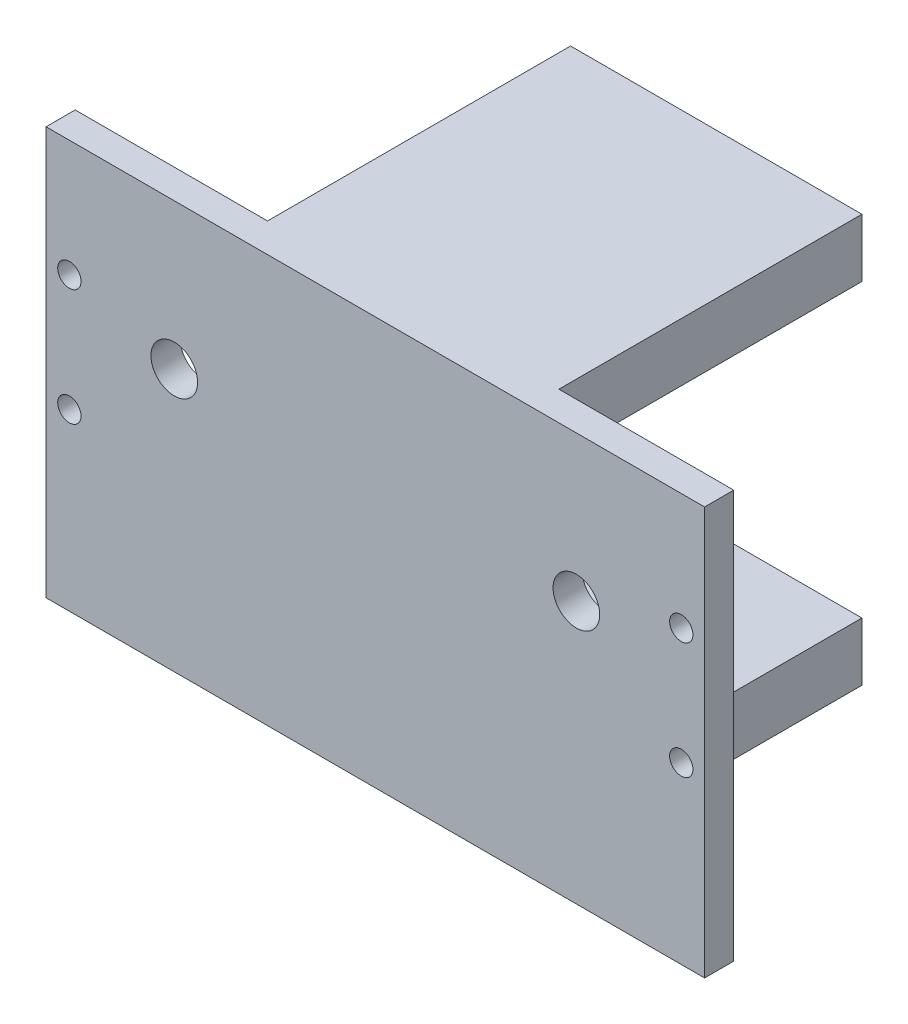
ISO-10303-21;
HEADER;
FILE_DESCRIPTION(('STEP AP214'),'2;1');
FILE_NAME('part.step','',(''),(''),'','','');
FILE_SCHEMA(('AUTOMOTIVE_DESIGN { 1 0 10303 214 1 1 1 1 }'));
ENDSEC;
DATA;
#1=APPLICATION_CONTEXT('core data for automotive mechanical design processes');
#2=APPLICATION_PROTOCOL_DEFINITION('international standard','automotive_design',2000,#1);
#3=PRODUCT_CONTEXT('',#1,'mechanical');
#4=PRODUCT('Part','Part','',(#3));
#5=PRODUCT_RELATED_PRODUCT_CATEGORY('part','',(#4));
#6=PRODUCT_DEFINITION_FORMATION('','',#4);
#7=PRODUCT_DEFINITION_CONTEXT('part definition',#1,'design');
#8=PRODUCT_DEFINITION('design','',#6,#7);
#9=PRODUCT_DEFINITION_SHAPE('','',#8);
#10=(LENGTH_UNIT() NAMED_UNIT(*) SI_UNIT(.MILLI.,.METRE.));
#11=(NAMED_UNIT(*) PLANE_ANGLE_UNIT() SI_UNIT($,.RADIAN.));
#12=(NAMED_UNIT(*) SI_UNIT($,.STERADIAN.) SOLID_ANGLE_UNIT());
#13=UNCERTAINTY_MEASURE_WITH_UNIT(LENGTH_MEASURE(1.E-05),#10,'distance_accuracy_value','');
#14=(GEOMETRIC_REPRESENTATION_CONTEXT(3) GLOBAL_UNCERTAINTY_ASSIGNED_CONTEXT((#13)) GLOBAL_UNIT_ASSIGNED_CONTEXT((#10,
#11,#12)) REPRESENTATION_CONTEXT('',''));
#15=CARTESIAN_POINT('',(0.,0.,0.));
#16=DIRECTION('',(0.,0.,1.));
#17=DIRECTION('',(1.,0.,0.));
#18=AXIS2_PLACEMENT_3D('',#15,#16,#17);
#19=CARTESIAN_POINT('',(0.,0.,0.));
#20=DIRECTION('',(0.,0.,1.));
#21=DIRECTION('',(1.,0.,0.));
#22=AXIS2_PLACEMENT_3D('',#19,#20,#21);
#23=PLANE('',#22);
#24=CARTESIAN_POINT('',(-52.4999999999998,-5.,0.));
#25=DIRECTION('',(0.,0.,1.));
#26=DIRECTION('',(1.,0.,0.));
#27=AXIS2_PLACEMENT_3D('',#24,#25,#26);
#28=CIRCLE('',#27,2.);
#29=CARTESIAN_POINT('',(-50.4999999999998,-5.,0.));
#30=VERTEX_POINT('',#29);
#31=EDGE_CURVE('E289',#30,#30,#28,.T.);
#32=ORIENTED_EDGE('',*,*,#31,.T.);
#33=EDGE_LOOP('',(#32));
#34=FACE_BOUND('',#33,.T.);
#35=CARTESIAN_POINT('',(52.5000000000002,-5.,0.));
#36=DIRECTION('',(0.,0.,1.));
#37=DIRECTION('',(1.,0.,0.));
#38=AXIS2_PLACEMENT_3D('',#35,#36,#37);
#39=CIRCLE('',#38,2.);
#40=CARTESIAN_POINT('',(54.5000000000002,-5.,0.));
#41=VERTEX_POINT('',#40);
#42=EDGE_CURVE('E283',#41,#41,#39,.T.);
#43=ORIENTED_EDGE('',*,*,#42,.T.);
#44=EDGE_LOOP('',(#43));
#45=FACE_BOUND('',#44,.T.);
#46=CARTESIAN_POINT('',(52.5,15.,0.));
#47=DIRECTION('',(0.,0.,1.));
#48=DIRECTION('',(1.,0.,0.));
#49=AXIS2_PLACEMENT_3D('',#46,#47,#48);
#50=CIRCLE('',#49,2.);
#51=CARTESIAN_POINT('',(54.5,15.,0.));
#52=VERTEX_POINT('',#51);
#53=EDGE_CURVE('E277',#52,#52,#50,.T.);
#54=ORIENTED_EDGE('',*,*,#53,.T.);
#55=EDGE_LOOP('',(#54));
#56=FACE_BOUND('',#55,.T.);
#57=CARTESIAN_POINT('',(-52.5,15.,0.));
#58=DIRECTION('',(0.,0.,1.));
#59=DIRECTION('',(1.,0.,0.));
#60=AXIS2_PLACEMENT_3D('',#57,#58,#59);
#61=CIRCLE('',#60,2.);
#62=CARTESIAN_POINT('',(-50.5,15.,0.));
#63=VERTEX_POINT('',#62);
#64=EDGE_CURVE('E269',#63,#63,#61,.T.);
#65=ORIENTED_EDGE('',*,*,#64,.T.);
#66=EDGE_LOOP('',(#65));
#67=FACE_BOUND('',#66,.T.);
#68=CARTESIAN_POINT('',(-34.5,9.99999999999999,0.));
#69=DIRECTION('',(0.,0.,-1.));
#70=DIRECTION('',(-1.,0.,0.));
#71=AXIS2_PLACEMENT_3D('',#68,#69,#70);
#72=CIRCLE('',#71,4.00000000000001);
#73=CARTESIAN_POINT('',(-38.5,9.99999999999999,0.));
#74=VERTEX_POINT('',#73);
#75=EDGE_CURVE('E266',#74,#74,#72,.T.);
#76=ORIENTED_EDGE('',*,*,#75,.F.);
#77=EDGE_LOOP('',(#76));
#78=FACE_BOUND('',#77,.T.);
#79=CARTESIAN_POINT('',(34.5,9.99999999999999,0.));
#80=DIRECTION('',(0.,0.,-1.));
#81=DIRECTION('',(-1.,0.,0.));
#82=AXIS2_PLACEMENT_3D('',#79,#80,#81);
#83=CIRCLE('',#82,4.);
#84=CARTESIAN_POINT('',(30.5,9.99999999999999,0.));
#85=VERTEX_POINT('',#84);
#86=EDGE_CURVE('E260',#85,#85,#83,.T.);
#87=ORIENTED_EDGE('',*,*,#86,.F.);
#88=EDGE_LOOP('',(#87));
#89=FACE_BOUND('',#88,.T.);
#90=DIRECTION('',(0.,-1.,0.));
#91=VECTOR('',#90,1.);
#92=CARTESIAN_POINT('',(26.5,35.,0.));
#93=LINE('',#92,#91);
#94=CARTESIAN_POINT('',(26.5,35.,0.));
#95=VERTEX_POINT('',#94);
#96=CARTESIAN_POINT('',(26.5,25.,0.));
#97=VERTEX_POINT('',#96);
#98=EDGE_CURVE('E147',#95,#97,#93,.T.);
#99=ORIENTED_EDGE('',*,*,#98,.F.);
#100=DIRECTION('',(1.,0.,0.));
#101=VECTOR('',#100,1.);
#102=CARTESIAN_POINT('',(-56.5,35.,0.));
#103=LINE('',#102,#101);
#104=CARTESIAN_POINT('',(56.5,35.,0.));
#105=VERTEX_POINT('',#104);
#106=EDGE_CURVE('E209',#95,#105,#103,.T.);
#107=ORIENTED_EDGE('',*,*,#106,.T.);
#108=DIRECTION('',(0.,-1.,0.));
#109=VECTOR('',#108,1.);
#110=CARTESIAN_POINT('',(56.5,35.,0.));
#111=LINE('',#110,#109);
#112=CARTESIAN_POINT('',(56.5,-35.,0.));
#113=VERTEX_POINT('',#112);
#114=EDGE_CURVE('E195',#105,#113,#111,.T.);
#115=ORIENTED_EDGE('',*,*,#114,.T.);
#116=DIRECTION('',(1.,0.,0.));
#117=VECTOR('',#116,1.);
#118=CARTESIAN_POINT('',(-56.5,-35.,0.));
#119=LINE('',#118,#117);
#120=CARTESIAN_POINT('',(26.5,-35.,0.));
#121=VERTEX_POINT('',#120);
#122=EDGE_CURVE('E191',#121,#113,#119,.T.);
#123=ORIENTED_EDGE('',*,*,#122,.F.);
#124=DIRECTION('',(0.,-1.,0.));
#125=VECTOR('',#124,1.);
#126=CARTESIAN_POINT('',(26.5,-35.,0.));
#127=LINE('',#126,#125);
#128=CARTESIAN_POINT('',(26.5,-25.,0.));
#129=VERTEX_POINT('',#128);
#130=EDGE_CURVE('E39',#129,#121,#127,.T.);
#131=ORIENTED_EDGE('',*,*,#130,.F.);
#132=DIRECTION('',(1.,0.,0.));
#133=VECTOR('',#132,1.);
#134=CARTESIAN_POINT('',(26.5,-25.,0.));
#135=LINE('',#134,#133);
#136=CARTESIAN_POINT('',(-23.5,-25.,0.));
#137=VERTEX_POINT('',#136);
#138=EDGE_CURVE('E159',#137,#129,#135,.T.);
#139=ORIENTED_EDGE('',*,*,#138,.F.);
#140=DIRECTION('',(0.,1.,0.));
#141=VECTOR('',#140,1.);
#142=CARTESIAN_POINT('',(-23.5,-35.,0.));
#143=LINE('',#142,#141);
#144=CARTESIAN_POINT('',(-23.5,-35.,0.));
#145=VERTEX_POINT('',#144);
#146=EDGE_CURVE('E150',#145,#137,#143,.T.);
#147=ORIENTED_EDGE('',*,*,#146,.F.);
#148=CARTESIAN_POINT('',(-56.5,-35.,0.));
#149=VERTEX_POINT('',#148);
#150=EDGE_CURVE('E201',#149,#145,#119,.T.);
#151=ORIENTED_EDGE('',*,*,#150,.F.);
#152=DIRECTION('',(0.,-1.,0.));
#153=VECTOR('',#152,1.);
#154=CARTESIAN_POINT('',(-56.5,35.,0.));
#155=LINE('',#154,#153);
#156=CARTESIAN_POINT('',(-56.5,35.,0.));
#157=VERTEX_POINT('',#156);
#158=EDGE_CURVE('E188',#157,#149,#155,.T.);
#159=ORIENTED_EDGE('',*,*,#158,.F.);
#160=CARTESIAN_POINT('',(-23.5,35.,0.));
#161=VERTEX_POINT('',#160);
#162=EDGE_CURVE('E179',#157,#161,#103,.T.);
#163=ORIENTED_EDGE('',*,*,#162,.T.);
#164=DIRECTION('',(0.,1.,0.));
#165=VECTOR('',#164,1.);
#166=CARTESIAN_POINT('',(-23.5,35.,0.));
#167=LINE('',#166,#165);
#168=CARTESIAN_POINT('',(-23.5,25.,0.));
#169=VERTEX_POINT('',#168);
#170=EDGE_CURVE('E58',#169,#161,#167,.T.);
#171=ORIENTED_EDGE('',*,*,#170,.F.);
#172=DIRECTION('',(-1.,0.,0.));
#173=VECTOR('',#172,1.);
#174=CARTESIAN_POINT('',(26.5,25.,0.));
#175=LINE('',#174,#173);
#176=EDGE_CURVE('E53',#97,#169,#175,.T.);
#177=ORIENTED_EDGE('',*,*,#176,.F.);
#178=EDGE_LOOP('',(#99,#107,#115,#123,#131,#139,#147,#151,#159,#163,#171,#177));
#179=FACE_BOUND('',#178,.T.);
#180=ADVANCED_FACE('F35',(#34,#45,#56,#67,#78,#89,#179),#23,.F.);
#181=CARTESIAN_POINT('',(-56.5,35.,5.));
#182=DIRECTION('',(1.,0.,0.));
#183=DIRECTION('',(0.,1.,0.));
#184=AXIS2_PLACEMENT_3D('',#181,#182,#183);
#185=PLANE('',#184);
#186=ORIENTED_EDGE('',*,*,#158,.T.);
#187=DIRECTION('',(0.,0.,-1.));
#188=VECTOR('',#187,1.);
#189=CARTESIAN_POINT('',(-56.5,-35.,5.));
#190=LINE('',#189,#188);
#191=CARTESIAN_POINT('',(-56.5,-35.,5.));
#192=VERTEX_POINT('',#191);
#193=EDGE_CURVE('E11',#192,#149,#190,.T.);
#194=ORIENTED_EDGE('',*,*,#193,.F.);
#195=DIRECTION('',(0.,-1.,0.));
#196=VECTOR('',#195,1.);
#197=CARTESIAN_POINT('',(-56.5,35.,5.));
#198=LINE('',#197,#196);
#199=CARTESIAN_POINT('',(-56.5,35.,5.));
#200=VERTEX_POINT('',#199);
#201=EDGE_CURVE('E175',#200,#192,#198,.T.);
#202=ORIENTED_EDGE('',*,*,#201,.F.);
#203=DIRECTION('',(0.,0.,-1.));
#204=VECTOR('',#203,1.);
#205=CARTESIAN_POINT('',(-56.5,35.,5.));
#206=LINE('',#205,#204);
#207=EDGE_CURVE('E187',#200,#157,#206,.T.);
#208=ORIENTED_EDGE('',*,*,#207,.T.);
#209=EDGE_LOOP('',(#186,#194,#202,#208));
#210=FACE_BOUND('',#209,.T.);
#211=ADVANCED_FACE('F37',(#210),#185,.F.);
#212=CARTESIAN_POINT('',(-56.5,-35.,5.));
#213=DIRECTION('',(0.,1.,0.));
#214=DIRECTION('',(0.,0.,1.));
#215=AXIS2_PLACEMENT_3D('',#212,#213,#214);
#216=PLANE('',#215);
#217=ORIENTED_EDGE('',*,*,#150,.T.);
#218=DIRECTION('',(0.,0.,1.));
#219=VECTOR('',#218,1.);
#220=CARTESIAN_POINT('',(-23.5,-35.,-52.));
#221=LINE('',#220,#219);
#222=CARTESIAN_POINT('',(-23.5,-35.,-52.));
#223=VERTEX_POINT('',#222);
#224=EDGE_CURVE('E174',#223,#145,#221,.T.);
#225=ORIENTED_EDGE('',*,*,#224,.F.);
#226=DIRECTION('',(-1.,0.,0.));
#227=VECTOR('',#226,1.);
#228=CARTESIAN_POINT('',(26.5,-35.,-52.));
#229=LINE('',#228,#227);
#230=CARTESIAN_POINT('',(26.5,-35.,-52.));
#231=VERTEX_POINT('',#230);
#232=EDGE_CURVE('E158',#231,#223,#229,.T.);
#233=ORIENTED_EDGE('',*,*,#232,.F.);
#234=DIRECTION('',(0.,0.,1.));
#235=VECTOR('',#234,1.);
#236=CARTESIAN_POINT('',(26.5,-35.,-52.));
#237=LINE('',#236,#235);
#238=EDGE_CURVE('E192',#231,#121,#237,.T.);
#239=ORIENTED_EDGE('',*,*,#238,.T.);
#240=ORIENTED_EDGE('',*,*,#122,.T.);
#241=DIRECTION('',(0.,0.,-1.));
#242=VECTOR('',#241,1.);
#243=CARTESIAN_POINT('',(56.5,-35.,5.));
#244=LINE('',#243,#242);
#245=CARTESIAN_POINT('',(56.5,-35.,5.));
#246=VERTEX_POINT('',#245);
#247=EDGE_CURVE('E45',#246,#113,#244,.T.);
#248=ORIENTED_EDGE('',*,*,#247,.F.);
#249=DIRECTION('',(1.,0.,0.));
#250=VECTOR('',#249,1.);
#251=CARTESIAN_POINT('',(-56.5,-35.,5.));
#252=LINE('',#251,#250);
#253=EDGE_CURVE('E178',#192,#246,#252,.T.);
#254=ORIENTED_EDGE('',*,*,#253,.F.);
#255=ORIENTED_EDGE('',*,*,#193,.T.);
#256=EDGE_LOOP('',(#217,#225,#233,#239,#240,#248,#254,#255));
#257=FACE_BOUND('',#256,.T.);
#258=ADVANCED_FACE('F220',(#257),#216,.F.);
#259=CARTESIAN_POINT('',(56.5,35.,5.));
#260=DIRECTION('',(1.,0.,0.));
#261=DIRECTION('',(0.,1.,0.));
#262=AXIS2_PLACEMENT_3D('',#259,#260,#261);
#263=PLANE('',#262);
#264=ORIENTED_EDGE('',*,*,#114,.F.);
#265=DIRECTION('',(0.,0.,-1.));
#266=VECTOR('',#265,1.);
#267=CARTESIAN_POINT('',(56.5,35.,5.));
#268=LINE('',#267,#266);
#269=CARTESIAN_POINT('',(56.5,35.,5.));
#270=VERTEX_POINT('',#269);
#271=EDGE_CURVE('E206',#270,#105,#268,.T.);
#272=ORIENTED_EDGE('',*,*,#271,.F.);
#273=DIRECTION('',(0.,-1.,0.));
#274=VECTOR('',#273,1.);
#275=CARTESIAN_POINT('',(56.5,35.,5.));
#276=LINE('',#275,#274);
#277=EDGE_CURVE('E181',#270,#246,#276,.T.);
#278=ORIENTED_EDGE('',*,*,#277,.T.);
#279=ORIENTED_EDGE('',*,*,#247,.T.);
#280=EDGE_LOOP('',(#264,#272,#278,#279));
#281=FACE_BOUND('',#280,.T.);
#282=ADVANCED_FACE('F216',(#281),#263,.T.);
#283=CARTESIAN_POINT('',(-56.5,35.,5.));
#284=DIRECTION('',(0.,1.,0.));
#285=DIRECTION('',(0.,0.,1.));
#286=AXIS2_PLACEMENT_3D('',#283,#284,#285);
#287=PLANE('',#286);
#288=ORIENTED_EDGE('',*,*,#162,.F.);
#289=ORIENTED_EDGE('',*,*,#207,.F.);
#290=DIRECTION('',(1.,0.,0.));
#291=VECTOR('',#290,1.);
#292=CARTESIAN_POINT('',(-56.5,35.,5.));
#293=LINE('',#292,#291);
#294=EDGE_CURVE('E184',#200,#270,#293,.T.);
#295=ORIENTED_EDGE('',*,*,#294,.T.);
#296=ORIENTED_EDGE('',*,*,#271,.T.);
#297=ORIENTED_EDGE('',*,*,#106,.F.);
#298=DIRECTION('',(0.,0.,1.));
#299=VECTOR('',#298,1.);
#300=CARTESIAN_POINT('',(26.5,35.,-52.));
#301=LINE('',#300,#299);
#302=CARTESIAN_POINT('',(26.5,35.,-52.));
#303=VERTEX_POINT('',#302);
#304=EDGE_CURVE('E251',#303,#95,#301,.T.);
#305=ORIENTED_EDGE('',*,*,#304,.F.);
#306=DIRECTION('',(1.,0.,0.));
#307=VECTOR('',#306,1.);
#308=CARTESIAN_POINT('',(26.5,35.,-52.));
#309=LINE('',#308,#307);
#310=CARTESIAN_POINT('',(-23.5,35.,-52.));
#311=VERTEX_POINT('',#310);
#312=EDGE_CURVE('E141',#311,#303,#309,.T.);
#313=ORIENTED_EDGE('',*,*,#312,.F.);
#314=DIRECTION('',(0.,0.,1.));
#315=VECTOR('',#314,1.);
#316=CARTESIAN_POINT('',(-23.5,35.,-52.));
#317=LINE('',#316,#315);
#318=EDGE_CURVE('E151',#311,#161,#317,.T.);
#319=ORIENTED_EDGE('',*,*,#318,.T.);
#320=EDGE_LOOP('',(#288,#289,#295,#296,#297,#305,#313,#319));
#321=FACE_BOUND('',#320,.T.);
#322=ADVANCED_FACE('F248',(#321),#287,.T.);
#323=CARTESIAN_POINT('',(0.,0.,5.));
#324=DIRECTION('',(0.,0.,1.));
#325=DIRECTION('',(1.,0.,0.));
#326=AXIS2_PLACEMENT_3D('',#323,#324,#325);
#327=PLANE('',#326);
#328=CARTESIAN_POINT('',(-52.4999999999998,-5.,5.));
#329=DIRECTION('',(0.,0.,1.));
#330=DIRECTION('',(1.,0.,0.));
#331=AXIS2_PLACEMENT_3D('',#328,#329,#330);
#332=CIRCLE('',#331,2.);
#333=CARTESIAN_POINT('',(-50.4999999999998,-5.,5.));
#334=VERTEX_POINT('',#333);
#335=EDGE_CURVE('E292',#334,#334,#332,.T.);
#336=ORIENTED_EDGE('',*,*,#335,.F.);
#337=EDGE_LOOP('',(#336));
#338=FACE_BOUND('',#337,.T.);
#339=CARTESIAN_POINT('',(52.5000000000002,-5.,5.));
#340=DIRECTION('',(0.,0.,1.));
#341=DIRECTION('',(1.,0.,0.));
#342=AXIS2_PLACEMENT_3D('',#339,#340,#341);
#343=CIRCLE('',#342,2.);
#344=CARTESIAN_POINT('',(54.5000000000002,-5.,5.));
#345=VERTEX_POINT('',#344);
#346=EDGE_CURVE('E286',#345,#345,#343,.T.);
#347=ORIENTED_EDGE('',*,*,#346,.F.);
#348=EDGE_LOOP('',(#347));
#349=FACE_BOUND('',#348,.T.);
#350=CARTESIAN_POINT('',(52.5,15.,5.));
#351=DIRECTION('',(0.,0.,1.));
#352=DIRECTION('',(1.,0.,0.));
#353=AXIS2_PLACEMENT_3D('',#350,#351,#352);
#354=CIRCLE('',#353,2.);
#355=CARTESIAN_POINT('',(54.5,15.,5.));
#356=VERTEX_POINT('',#355);
#357=EDGE_CURVE('E280',#356,#356,#354,.T.);
#358=ORIENTED_EDGE('',*,*,#357,.F.);
#359=EDGE_LOOP('',(#358));
#360=FACE_BOUND('',#359,.T.);
#361=CARTESIAN_POINT('',(-52.5,15.,5.));
#362=DIRECTION('',(0.,0.,1.));
#363=DIRECTION('',(1.,0.,0.));
#364=AXIS2_PLACEMENT_3D('',#361,#362,#363);
#365=CIRCLE('',#364,2.);
#366=CARTESIAN_POINT('',(-50.5,15.,5.));
#367=VERTEX_POINT('',#366);
#368=EDGE_CURVE('E274',#367,#367,#365,.T.);
#369=ORIENTED_EDGE('',*,*,#368,.F.);
#370=EDGE_LOOP('',(#369));
#371=FACE_BOUND('',#370,.T.);
#372=CARTESIAN_POINT('',(-34.5,9.99999999999999,5.));
#373=DIRECTION('',(0.,0.,-1.));
#374=DIRECTION('',(-1.,0.,0.));
#375=AXIS2_PLACEMENT_3D('',#372,#373,#374);
#376=CIRCLE('',#375,4.00000000000001);
#377=CARTESIAN_POINT('',(-38.5,9.99999999999999,5.));
#378=VERTEX_POINT('',#377);
#379=EDGE_CURVE('E263',#378,#378,#376,.T.);
#380=ORIENTED_EDGE('',*,*,#379,.T.);
#381=EDGE_LOOP('',(#380));
#382=FACE_BOUND('',#381,.T.);
#383=CARTESIAN_POINT('',(34.5,9.99999999999999,5.));
#384=DIRECTION('',(0.,0.,-1.));
#385=DIRECTION('',(-1.,0.,0.));
#386=AXIS2_PLACEMENT_3D('',#383,#384,#385);
#387=CIRCLE('',#386,4.);
#388=CARTESIAN_POINT('',(30.5,9.99999999999999,5.));
#389=VERTEX_POINT('',#388);
#390=EDGE_CURVE('E257',#389,#389,#387,.T.);
#391=ORIENTED_EDGE('',*,*,#390,.T.);
#392=EDGE_LOOP('',(#391));
#393=FACE_BOUND('',#392,.T.);
#394=ORIENTED_EDGE('',*,*,#201,.T.);
#395=ORIENTED_EDGE('',*,*,#253,.T.);
#396=ORIENTED_EDGE('',*,*,#277,.F.);
#397=ORIENTED_EDGE('',*,*,#294,.F.);
#398=EDGE_LOOP('',(#394,#395,#396,#397));
#399=FACE_BOUND('',#398,.T.);
#400=ADVANCED_FACE('F299',(#338,#349,#360,#371,#382,#393,#399),#327,.T.);
#401=CARTESIAN_POINT('',(26.5,-35.,-52.));
#402=DIRECTION('',(-1.,0.,0.));
#403=DIRECTION('',(0.,0.,1.));
#404=AXIS2_PLACEMENT_3D('',#401,#402,#403);
#405=PLANE('',#404);
#406=ORIENTED_EDGE('',*,*,#130,.T.);
#407=ORIENTED_EDGE('',*,*,#238,.F.);
#408=DIRECTION('',(0.,-1.,0.));
#409=VECTOR('',#408,1.);
#410=CARTESIAN_POINT('',(26.5,-35.,-52.));
#411=LINE('',#410,#409);
#412=CARTESIAN_POINT('',(26.5,-25.,-52.));
#413=VERTEX_POINT('',#412);
#414=EDGE_CURVE('E155',#413,#231,#411,.T.);
#415=ORIENTED_EDGE('',*,*,#414,.F.);
#416=DIRECTION('',(0.,0.,1.));
#417=VECTOR('',#416,1.);
#418=CARTESIAN_POINT('',(26.5,-25.,-52.));
#419=LINE('',#418,#417);
#420=EDGE_CURVE('E164',#413,#129,#419,.T.);
#421=ORIENTED_EDGE('',*,*,#420,.T.);
#422=EDGE_LOOP('',(#406,#407,#415,#421));
#423=FACE_BOUND('',#422,.T.);
#424=ADVANCED_FACE('F226',(#423),#405,.F.);
#425=CARTESIAN_POINT('',(-23.5,-35.,-52.));
#426=DIRECTION('',(1.,0.,0.));
#427=DIRECTION('',(0.,0.,-1.));
#428=AXIS2_PLACEMENT_3D('',#425,#426,#427);
#429=PLANE('',#428);
#430=ORIENTED_EDGE('',*,*,#146,.T.);
#431=DIRECTION('',(0.,0.,1.));
#432=VECTOR('',#431,1.);
#433=CARTESIAN_POINT('',(-23.5,-25.,-52.));
#434=LINE('',#433,#432);
#435=CARTESIAN_POINT('',(-23.5,-25.,-52.));
#436=VERTEX_POINT('',#435);
#437=EDGE_CURVE('E171',#436,#137,#434,.T.);
#438=ORIENTED_EDGE('',*,*,#437,.F.);
#439=DIRECTION('',(0.,1.,0.));
#440=VECTOR('',#439,1.);
#441=CARTESIAN_POINT('',(-23.5,-35.,-52.));
#442=LINE('',#441,#440);
#443=EDGE_CURVE('E161',#223,#436,#442,.T.);
#444=ORIENTED_EDGE('',*,*,#443,.F.);
#445=ORIENTED_EDGE('',*,*,#224,.T.);
#446=EDGE_LOOP('',(#430,#438,#444,#445));
#447=FACE_BOUND('',#446,.T.);
#448=ADVANCED_FACE('F235',(#447),#429,.F.);
#449=CARTESIAN_POINT('',(26.5,-25.,-52.));
#450=DIRECTION('',(0.,-1.,0.));
#451=DIRECTION('',(0.,0.,-1.));
#452=AXIS2_PLACEMENT_3D('',#449,#450,#451);
#453=PLANE('',#452);
#454=ORIENTED_EDGE('',*,*,#138,.T.);
#455=ORIENTED_EDGE('',*,*,#420,.F.);
#456=DIRECTION('',(1.,0.,0.));
#457=VECTOR('',#456,1.);
#458=CARTESIAN_POINT('',(26.5,-25.,-52.));
#459=LINE('',#458,#457);
#460=EDGE_CURVE('E163',#436,#413,#459,.T.);
#461=ORIENTED_EDGE('',*,*,#460,.F.);
#462=ORIENTED_EDGE('',*,*,#437,.T.);
#463=EDGE_LOOP('',(#454,#455,#461,#462));
#464=FACE_BOUND('',#463,.T.);
#465=ADVANCED_FACE('F230',(#464),#453,.F.);
#466=CARTESIAN_POINT('',(0.,0.,-52.));
#467=DIRECTION('',(0.,0.,1.));
#468=DIRECTION('',(1.,0.,0.));
#469=AXIS2_PLACEMENT_3D('',#466,#467,#468);
#470=PLANE('',#469);
#471=ORIENTED_EDGE('',*,*,#414,.T.);
#472=ORIENTED_EDGE('',*,*,#232,.T.);
#473=ORIENTED_EDGE('',*,*,#443,.T.);
#474=ORIENTED_EDGE('',*,*,#460,.T.);
#475=EDGE_LOOP('',(#471,#472,#473,#474));
#476=FACE_BOUND('',#475,.T.);
#477=ADVANCED_FACE('F369',(#476),#470,.F.);
#478=CARTESIAN_POINT('',(26.5,35.,-52.));
#479=DIRECTION('',(-1.,0.,0.));
#480=DIRECTION('',(0.,0.,1.));
#481=AXIS2_PLACEMENT_3D('',#478,#479,#480);
#482=PLANE('',#481);
#483=ORIENTED_EDGE('',*,*,#98,.T.);
#484=DIRECTION('',(0.,0.,1.));
#485=VECTOR('',#484,1.);
#486=CARTESIAN_POINT('',(26.5,25.,-52.));
#487=LINE('',#486,#485);
#488=CARTESIAN_POINT('',(26.5,25.,-52.));
#489=VERTEX_POINT('',#488);
#490=EDGE_CURVE('E129',#489,#97,#487,.T.);
#491=ORIENTED_EDGE('',*,*,#490,.F.);
#492=DIRECTION('',(0.,-1.,0.));
#493=VECTOR('',#492,1.);
#494=CARTESIAN_POINT('',(26.5,35.,-52.));
#495=LINE('',#494,#493);
#496=EDGE_CURVE('E136',#303,#489,#495,.T.);
#497=ORIENTED_EDGE('',*,*,#496,.F.);
#498=ORIENTED_EDGE('',*,*,#304,.T.);
#499=EDGE_LOOP('',(#483,#491,#497,#498));
#500=FACE_BOUND('',#499,.T.);
#501=ADVANCED_FACE('F146',(#500),#482,.F.);
#502=CARTESIAN_POINT('',(26.5,25.,-52.));
#503=DIRECTION('',(0.,1.,0.));
#504=DIRECTION('',(0.,0.,1.));
#505=AXIS2_PLACEMENT_3D('',#502,#503,#504);
#506=PLANE('',#505);
#507=ORIENTED_EDGE('',*,*,#176,.T.);
#508=DIRECTION('',(0.,0.,1.));
#509=VECTOR('',#508,1.);
#510=CARTESIAN_POINT('',(-23.5,25.,-52.));
#511=LINE('',#510,#509);
#512=CARTESIAN_POINT('',(-23.5,25.,-52.));
#513=VERTEX_POINT('',#512);
#514=EDGE_CURVE('E132',#513,#169,#511,.T.);
#515=ORIENTED_EDGE('',*,*,#514,.F.);
#516=DIRECTION('',(-1.,0.,0.));
#517=VECTOR('',#516,1.);
#518=CARTESIAN_POINT('',(26.5,25.,-52.));
#519=LINE('',#518,#517);
#520=EDGE_CURVE('E125',#489,#513,#519,.T.);
#521=ORIENTED_EDGE('',*,*,#520,.F.);
#522=ORIENTED_EDGE('',*,*,#490,.T.);
#523=EDGE_LOOP('',(#507,#515,#521,#522));
#524=FACE_BOUND('',#523,.T.);
#525=ADVANCED_FACE('F127',(#524),#506,.F.);
#526=CARTESIAN_POINT('',(-23.5,35.,-52.));
#527=DIRECTION('',(1.,0.,0.));
#528=DIRECTION('',(0.,1.,0.));
#529=AXIS2_PLACEMENT_3D('',#526,#527,#528);
#530=PLANE('',#529);
#531=ORIENTED_EDGE('',*,*,#170,.T.);
#532=ORIENTED_EDGE('',*,*,#318,.F.);
#533=DIRECTION('',(0.,1.,0.));
#534=VECTOR('',#533,1.);
#535=CARTESIAN_POINT('',(-23.5,35.,-52.));
#536=LINE('',#535,#534);
#537=EDGE_CURVE('E135',#513,#311,#536,.T.);
#538=ORIENTED_EDGE('',*,*,#537,.F.);
#539=ORIENTED_EDGE('',*,*,#514,.T.);
#540=EDGE_LOOP('',(#531,#532,#538,#539));
#541=FACE_BOUND('',#540,.T.);
#542=ADVANCED_FACE('F389',(#541),#530,.F.);
#543=CARTESIAN_POINT('',(0.,0.,-52.));
#544=DIRECTION('',(0.,0.,-1.));
#545=DIRECTION('',(-1.,0.,0.));
#546=AXIS2_PLACEMENT_3D('',#543,#544,#545);
#547=PLANE('',#546);
#548=ORIENTED_EDGE('',*,*,#496,.T.);
#549=ORIENTED_EDGE('',*,*,#520,.T.);
#550=ORIENTED_EDGE('',*,*,#537,.T.);
#551=ORIENTED_EDGE('',*,*,#312,.T.);
#552=EDGE_LOOP('',(#548,#549,#550,#551));
#553=FACE_BOUND('',#552,.T.);
#554=ADVANCED_FACE('F139',(#553),#547,.T.);
#555=CARTESIAN_POINT('',(34.5,9.99999999999999,5.));
#556=DIRECTION('',(0.,0.,-1.));
#557=DIRECTION('',(-1.,0.,0.));
#558=AXIS2_PLACEMENT_3D('',#555,#556,#557);
#559=CYLINDRICAL_SURFACE('',#558,4.);
#560=ORIENTED_EDGE('',*,*,#390,.F.);
#561=EDGE_LOOP('',(#560));
#562=FACE_BOUND('',#561,.T.);
#563=ORIENTED_EDGE('',*,*,#86,.T.);
#564=EDGE_LOOP('',(#563));
#565=FACE_BOUND('',#564,.T.);
#566=ADVANCED_FACE('F315',(#562,#565),#559,.F.);
#567=CARTESIAN_POINT('',(-34.5,9.99999999999999,5.));
#568=DIRECTION('',(0.,0.,-1.));
#569=DIRECTION('',(-1.,0.,0.));
#570=AXIS2_PLACEMENT_3D('',#567,#568,#569);
#571=CYLINDRICAL_SURFACE('',#570,4.00000000000001);
#572=ORIENTED_EDGE('',*,*,#379,.F.);
#573=EDGE_LOOP('',(#572));
#574=FACE_BOUND('',#573,.T.);
#575=ORIENTED_EDGE('',*,*,#75,.T.);
#576=EDGE_LOOP('',(#575));
#577=FACE_BOUND('',#576,.T.);
#578=ADVANCED_FACE('F318',(#574,#577),#571,.F.);
#579=CARTESIAN_POINT('',(-52.5,15.,-52.000025));
#580=DIRECTION('',(0.,0.,1.));
#581=DIRECTION('',(1.,0.,0.));
#582=AXIS2_PLACEMENT_3D('',#579,#580,#581);
#583=CYLINDRICAL_SURFACE('',#582,2.);
#584=CARTESIAN_POINT('',(-50.5,15.,5.));
#585=CARTESIAN_POINT('',(-50.5,15.,4.94791666666667));
#586=CARTESIAN_POINT('',(-50.5,15.,4.89583333333334));
#587=CARTESIAN_POINT('',(-50.5,15.,4.79166666666667));
#588=CARTESIAN_POINT('',(-50.5,15.,4.73958333333334));
#589=CARTESIAN_POINT('',(-50.5,15.,4.63541666666667));
#590=CARTESIAN_POINT('',(-50.5,15.,4.58333333333333));
#591=CARTESIAN_POINT('',(-50.5,15.,4.47916666666667));
#592=CARTESIAN_POINT('',(-50.5,15.,4.42708333333334));
#593=CARTESIAN_POINT('',(-50.5,15.,4.32291666666667));
#594=CARTESIAN_POINT('',(-50.5,15.,4.27083333333334));
#595=CARTESIAN_POINT('',(-50.5,15.,4.16666666666667));
#596=CARTESIAN_POINT('',(-50.5,15.,4.11458333333334));
#597=CARTESIAN_POINT('',(-50.5,15.,4.01041666666667));
#598=CARTESIAN_POINT('',(-50.5,15.,3.95833333333333));
#599=CARTESIAN_POINT('',(-50.5,15.,3.85416666666667));
#600=CARTESIAN_POINT('',(-50.5,15.,3.80208333333334));
#601=CARTESIAN_POINT('',(-50.5,15.,3.69791666666667));
#602=CARTESIAN_POINT('',(-50.5,15.,3.64583333333334));
#603=CARTESIAN_POINT('',(-50.5,15.,3.54166666666667));
#604=CARTESIAN_POINT('',(-50.5,15.,3.48958333333334));
#605=CARTESIAN_POINT('',(-50.5,15.,3.38541666666667));
#606=CARTESIAN_POINT('',(-50.5,15.,3.33333333333333));
#607=CARTESIAN_POINT('',(-50.5,15.,3.22916666666667));
#608=CARTESIAN_POINT('',(-50.5,15.,3.17708333333334));
#609=CARTESIAN_POINT('',(-50.5,15.,3.07291666666667));
#610=CARTESIAN_POINT('',(-50.5,15.,3.02083333333334));
#611=CARTESIAN_POINT('',(-50.5,15.,2.91666666666667));
#612=CARTESIAN_POINT('',(-50.5,15.,2.86458333333334));
#613=CARTESIAN_POINT('',(-50.5,15.,2.76041666666667));
#614=CARTESIAN_POINT('',(-50.5,15.,2.70833333333333));
#615=CARTESIAN_POINT('',(-50.5,15.,2.60416666666667));
#616=CARTESIAN_POINT('',(-50.5,15.,2.55208333333333));
#617=CARTESIAN_POINT('',(-50.5,15.,2.44791666666667));
#618=CARTESIAN_POINT('',(-50.5,15.,2.39583333333334));
#619=CARTESIAN_POINT('',(-50.5,15.,2.29166666666667));
#620=CARTESIAN_POINT('',(-50.5,15.,2.23958333333334));
#621=CARTESIAN_POINT('',(-50.5,15.,2.13541666666667));
#622=CARTESIAN_POINT('',(-50.5,15.,2.08333333333333));
#623=CARTESIAN_POINT('',(-50.5,15.,1.97916666666667));
#624=CARTESIAN_POINT('',(-50.5,15.,1.92708333333333));
#625=CARTESIAN_POINT('',(-50.5,15.,1.82291666666667));
#626=CARTESIAN_POINT('',(-50.5,15.,1.77083333333334));
#627=CARTESIAN_POINT('',(-50.5,15.,1.66666666666667));
#628=CARTESIAN_POINT('',(-50.5,15.,1.61458333333334));
#629=CARTESIAN_POINT('',(-50.5,15.,1.51041666666667));
#630=CARTESIAN_POINT('',(-50.5,15.,1.45833333333333));
#631=CARTESIAN_POINT('',(-50.5,15.,1.35416666666667));
#632=CARTESIAN_POINT('',(-50.5,15.,1.30208333333333));
#633=CARTESIAN_POINT('',(-50.5,15.,1.19791666666667));
#634=CARTESIAN_POINT('',(-50.5,15.,1.14583333333334));
#635=CARTESIAN_POINT('',(-50.5,15.,1.04166666666667));
#636=CARTESIAN_POINT('',(-50.5,15.,0.989583333333335));
#637=CARTESIAN_POINT('',(-50.5,15.,0.885416666666666));
#638=CARTESIAN_POINT('',(-50.5,15.,0.833333333333332));
#639=CARTESIAN_POINT('',(-50.5,15.,0.729166666666665));
#640=CARTESIAN_POINT('',(-50.5,15.,0.677083333333333));
#641=CARTESIAN_POINT('',(-50.5,15.,0.572916666666668));
#642=CARTESIAN_POINT('',(-50.5,15.,0.520833333333336));
#643=CARTESIAN_POINT('',(-50.5,15.,0.416666666666669));
#644=CARTESIAN_POINT('',(-50.5,15.,0.364583333333335));
#645=CARTESIAN_POINT('',(-50.5,15.,0.260416666666666));
#646=CARTESIAN_POINT('',(-50.5,15.,0.208333333333331));
#647=CARTESIAN_POINT('',(-50.5,15.,0.104166666666664));
#648=CARTESIAN_POINT('',(-50.5,15.,0.0520833333333322));
#649=CARTESIAN_POINT('',(-50.5,15.,0.));
#650=B_SPLINE_CURVE_WITH_KNOTS('',3,(#584,#585,#586,#587,#588,#589,#590,#591,#592,#593,#594,
#595,#596,#597,#598,#599,#600,#601,#602,#603,#604,#605,#606,#607,#608,#609,#610,#611,#612,#613,
#614,#615,#616,#617,#618,#619,#620,#621,#622,#623,#624,#625,#626,#627,#628,#629,#630,#631,#632,
#633,#634,#635,#636,#637,#638,#639,#640,#641,#642,#643,#644,#645,#646,#647,#648,#649),
.UNSPECIFIED.,.F.,.F.,(4,2,2,2,2,2,2,2,2,2,2,2,2,2,2,2,2,2,2,2,2,2,2,2,2,2,2,2,2,2,2,2,4),(0.,
0.156249999999997,0.3125,0.468750000000004,0.625000000000001,0.781249999999997,
0.937500000000001,1.09375,1.25,1.40625,1.5625,1.71875,1.875,2.03125,2.1875,2.34375000000001,2.5,
2.65625,2.8125,2.96875000000001,3.125,3.28125,3.4375,3.59375000000001,3.75,3.90625,4.0625,
4.21875000000001,4.375,4.53125,4.6875,4.84375000000001,5.),.UNSPECIFIED.);
#651=EDGE_CURVE('BSEAM412',#367,#63,#650,.T.);
#652=ORIENTED_EDGE('',*,*,#368,.T.);
#653=ORIENTED_EDGE('',*,*,#64,.F.);
#654=ORIENTED_EDGE('',*,*,#651,.T.);
#655=ORIENTED_EDGE('',*,*,#651,.F.);
#656=EDGE_LOOP('',(#652,#654,#653,#655));
#657=FACE_BOUND('',#656,.T.);
#658=ADVANCED_FACE('F412',(#657),#583,.F.);
#659=CARTESIAN_POINT('',(52.5,15.,-52.000025));
#660=DIRECTION('',(0.,0.,1.));
#661=DIRECTION('',(1.,0.,0.));
#662=AXIS2_PLACEMENT_3D('',#659,#660,#661);
#663=CYLINDRICAL_SURFACE('',#662,2.);
#664=CARTESIAN_POINT('',(54.5,15.,5.));
#665=CARTESIAN_POINT('',(54.5,15.,4.94791666666667));
#666=CARTESIAN_POINT('',(54.5,15.,4.89583333333334));
#667=CARTESIAN_POINT('',(54.5,15.,4.79166666666667));
#668=CARTESIAN_POINT('',(54.5,15.,4.73958333333334));
#669=CARTESIAN_POINT('',(54.5,15.,4.63541666666667));
#670=CARTESIAN_POINT('',(54.5,15.,4.58333333333333));
#671=CARTESIAN_POINT('',(54.5,15.,4.47916666666667));
#672=CARTESIAN_POINT('',(54.5,15.,4.42708333333334));
#673=CARTESIAN_POINT('',(54.5,15.,4.32291666666667));
#674=CARTESIAN_POINT('',(54.5,15.,4.27083333333334));
#675=CARTESIAN_POINT('',(54.5,15.,4.16666666666667));
#676=CARTESIAN_POINT('',(54.5,15.,4.11458333333334));
#677=CARTESIAN_POINT('',(54.5,15.,4.01041666666667));
#678=CARTESIAN_POINT('',(54.5,15.,3.95833333333333));
#679=CARTESIAN_POINT('',(54.5,15.,3.85416666666667));
#680=CARTESIAN_POINT('',(54.5,15.,3.80208333333334));
#681=CARTESIAN_POINT('',(54.5,15.,3.69791666666667));
#682=CARTESIAN_POINT('',(54.5,15.,3.64583333333334));
#683=CARTESIAN_POINT('',(54.5,15.,3.54166666666667));
#684=CARTESIAN_POINT('',(54.5,15.,3.48958333333334));
#685=CARTESIAN_POINT('',(54.5,15.,3.38541666666667));
#686=CARTESIAN_POINT('',(54.5,15.,3.33333333333333));
#687=CARTESIAN_POINT('',(54.5,15.,3.22916666666667));
#688=CARTESIAN_POINT('',(54.5,15.,3.17708333333334));
#689=CARTESIAN_POINT('',(54.5,15.,3.07291666666667));
#690=CARTESIAN_POINT('',(54.5,15.,3.02083333333334));
#691=CARTESIAN_POINT('',(54.5,15.,2.91666666666667));
#692=CARTESIAN_POINT('',(54.5,15.,2.86458333333334));
#693=CARTESIAN_POINT('',(54.5,15.,2.76041666666667));
#694=CARTESIAN_POINT('',(54.5,15.,2.70833333333333));
#695=CARTESIAN_POINT('',(54.5,15.,2.60416666666667));
#696=CARTESIAN_POINT('',(54.5,15.,2.55208333333333));
#697=CARTESIAN_POINT('',(54.5,15.,2.44791666666667));
#698=CARTESIAN_POINT('',(54.5,15.,2.39583333333334));
#699=CARTESIAN_POINT('',(54.5,15.,2.29166666666667));
#700=CARTESIAN_POINT('',(54.5,15.,2.23958333333334));
#701=CARTESIAN_POINT('',(54.5,15.,2.13541666666667));
#702=CARTESIAN_POINT('',(54.5,15.,2.08333333333333));
#703=CARTESIAN_POINT('',(54.5,15.,1.97916666666667));
#704=CARTESIAN_POINT('',(54.5,15.,1.92708333333333));
#705=CARTESIAN_POINT('',(54.5,15.,1.82291666666667));
#706=CARTESIAN_POINT('',(54.5,15.,1.77083333333334));
#707=CARTESIAN_POINT('',(54.5,15.,1.66666666666667));
#708=CARTESIAN_POINT('',(54.5,15.,1.61458333333334));
#709=CARTESIAN_POINT('',(54.5,15.,1.51041666666667));
#710=CARTESIAN_POINT('',(54.5,15.,1.45833333333333));
#711=CARTESIAN_POINT('',(54.5,15.,1.35416666666667));
#712=CARTESIAN_POINT('',(54.5,15.,1.30208333333333));
#713=CARTESIAN_POINT('',(54.5,15.,1.19791666666667));
#714=CARTESIAN_POINT('',(54.5,15.,1.14583333333334));
#715=CARTESIAN_POINT('',(54.5,15.,1.04166666666667));
#716=CARTESIAN_POINT('',(54.5,15.,0.989583333333335));
#717=CARTESIAN_POINT('',(54.5,15.,0.885416666666666));
#718=CARTESIAN_POINT('',(54.5,15.,0.833333333333332));
#719=CARTESIAN_POINT('',(54.5,15.,0.729166666666665));
#720=CARTESIAN_POINT('',(54.5,15.,0.677083333333333));
#721=CARTESIAN_POINT('',(54.5,15.,0.572916666666668));
#722=CARTESIAN_POINT('',(54.5,15.,0.520833333333336));
#723=CARTESIAN_POINT('',(54.5,15.,0.416666666666669));
#724=CARTESIAN_POINT('',(54.5,15.,0.364583333333335));
#725=CARTESIAN_POINT('',(54.5,15.,0.260416666666666));
#726=CARTESIAN_POINT('',(54.5,15.,0.208333333333331));
#727=CARTESIAN_POINT('',(54.5,15.,0.104166666666664));
#728=CARTESIAN_POINT('',(54.5,15.,0.0520833333333322));
#729=CARTESIAN_POINT('',(54.5,15.,0.));
#730=B_SPLINE_CURVE_WITH_KNOTS('',3,(#664,#665,#666,#667,#668,#669,#670,#671,#672,#673,#674,
#675,#676,#677,#678,#679,#680,#681,#682,#683,#684,#685,#686,#687,#688,#689,#690,#691,#692,#693,
#694,#695,#696,#697,#698,#699,#700,#701,#702,#703,#704,#705,#706,#707,#708,#709,#710,#711,#712,
#713,#714,#715,#716,#717,#718,#719,#720,#721,#722,#723,#724,#725,#726,#727,#728,#729),
.UNSPECIFIED.,.F.,.F.,(4,2,2,2,2,2,2,2,2,2,2,2,2,2,2,2,2,2,2,2,2,2,2,2,2,2,2,2,2,2,2,2,4),(0.,
0.156249999999997,0.3125,0.468750000000004,0.625000000000001,0.781249999999997,
0.937500000000001,1.09375,1.25,1.40625,1.5625,1.71875,1.875,2.03125,2.1875,2.34375000000001,2.5,
2.65625,2.8125,2.96875000000001,3.125,3.28125,3.4375,3.59375000000001,3.75,3.90625,4.0625,
4.21875000000001,4.375,4.53125,4.6875,4.84375000000001,5.),.UNSPECIFIED.);
#731=EDGE_CURVE('BSEAM419',#356,#52,#730,.T.);
#732=ORIENTED_EDGE('',*,*,#357,.T.);
#733=ORIENTED_EDGE('',*,*,#53,.F.);
#734=ORIENTED_EDGE('',*,*,#731,.T.);
#735=ORIENTED_EDGE('',*,*,#731,.F.);
#736=EDGE_LOOP('',(#732,#734,#733,#735));
#737=FACE_BOUND('',#736,.T.);
#738=ADVANCED_FACE('F419',(#737),#663,.F.);
#739=CARTESIAN_POINT('',(52.5000000000002,-5.,-52.000025));
#740=DIRECTION('',(0.,0.,1.));
#741=DIRECTION('',(1.,0.,0.));
#742=AXIS2_PLACEMENT_3D('',#739,#740,#741);
#743=CYLINDRICAL_SURFACE('',#742,2.);
#744=CARTESIAN_POINT('',(54.5000000000002,-5.,5.));
#745=CARTESIAN_POINT('',(54.5000000000002,-5.,4.94791666666667));
#746=CARTESIAN_POINT('',(54.5000000000002,-5.,4.89583333333334));
#747=CARTESIAN_POINT('',(54.5000000000002,-5.,4.79166666666667));
#748=CARTESIAN_POINT('',(54.5000000000002,-5.,4.73958333333334));
#749=CARTESIAN_POINT('',(54.5000000000002,-5.,4.63541666666667));
#750=CARTESIAN_POINT('',(54.5000000000002,-5.,4.58333333333333));
#751=CARTESIAN_POINT('',(54.5000000000002,-5.,4.47916666666667));
#752=CARTESIAN_POINT('',(54.5000000000002,-5.,4.42708333333334));
#753=CARTESIAN_POINT('',(54.5000000000002,-5.,4.32291666666667));
#754=CARTESIAN_POINT('',(54.5000000000002,-5.,4.27083333333334));
#755=CARTESIAN_POINT('',(54.5000000000002,-5.,4.16666666666667));
#756=CARTESIAN_POINT('',(54.5000000000002,-5.,4.11458333333334));
#757=CARTESIAN_POINT('',(54.5000000000002,-5.,4.01041666666667));
#758=CARTESIAN_POINT('',(54.5000000000002,-5.,3.95833333333333));
#759=CARTESIAN_POINT('',(54.5000000000002,-5.,3.85416666666667));
#760=CARTESIAN_POINT('',(54.5000000000002,-5.,3.80208333333334));
#761=CARTESIAN_POINT('',(54.5000000000002,-5.,3.69791666666667));
#762=CARTESIAN_POINT('',(54.5000000000002,-5.,3.64583333333334));
#763=CARTESIAN_POINT('',(54.5000000000002,-5.,3.54166666666667));
#764=CARTESIAN_POINT('',(54.5000000000002,-5.,3.48958333333334));
#765=CARTESIAN_POINT('',(54.5000000000002,-5.,3.38541666666667));
#766=CARTESIAN_POINT('',(54.5000000000002,-5.,3.33333333333333));
#767=CARTESIAN_POINT('',(54.5000000000002,-5.,3.22916666666667));
#768=CARTESIAN_POINT('',(54.5000000000002,-5.,3.17708333333334));
#769=CARTESIAN_POINT('',(54.5000000000002,-5.,3.07291666666667));
#770=CARTESIAN_POINT('',(54.5000000000002,-5.,3.02083333333334));
#771=CARTESIAN_POINT('',(54.5000000000002,-5.,2.91666666666667));
#772=CARTESIAN_POINT('',(54.5000000000002,-5.,2.86458333333334));
#773=CARTESIAN_POINT('',(54.5000000000002,-5.,2.76041666666667));
#774=CARTESIAN_POINT('',(54.5000000000002,-5.,2.70833333333333));
#775=CARTESIAN_POINT('',(54.5000000000002,-5.,2.60416666666667));
#776=CARTESIAN_POINT('',(54.5000000000002,-5.,2.55208333333333));
#777=CARTESIAN_POINT('',(54.5000000000002,-5.,2.44791666666667));
#778=CARTESIAN_POINT('',(54.5000000000002,-5.,2.39583333333334));
#779=CARTESIAN_POINT('',(54.5000000000002,-5.,2.29166666666667));
#780=CARTESIAN_POINT('',(54.5000000000002,-5.,2.23958333333334));
#781=CARTESIAN_POINT('',(54.5000000000002,-5.,2.13541666666667));
#782=CARTESIAN_POINT('',(54.5000000000002,-5.,2.08333333333333));
#783=CARTESIAN_POINT('',(54.5000000000002,-5.,1.97916666666667));
#784=CARTESIAN_POINT('',(54.5000000000002,-5.,1.92708333333333));
#785=CARTESIAN_POINT('',(54.5000000000002,-5.,1.82291666666667));
#786=CARTESIAN_POINT('',(54.5000000000002,-5.,1.77083333333334));
#787=CARTESIAN_POINT('',(54.5000000000002,-5.,1.66666666666667));
#788=CARTESIAN_POINT('',(54.5000000000002,-5.,1.61458333333334));
#789=CARTESIAN_POINT('',(54.5000000000002,-5.,1.51041666666667));
#790=CARTESIAN_POINT('',(54.5000000000002,-5.,1.45833333333333));
#791=CARTESIAN_POINT('',(54.5000000000002,-5.,1.35416666666667));
#792=CARTESIAN_POINT('',(54.5000000000002,-5.,1.30208333333333));
#793=CARTESIAN_POINT('',(54.5000000000002,-5.,1.19791666666667));
#794=CARTESIAN_POINT('',(54.5000000000002,-5.,1.14583333333334));
#795=CARTESIAN_POINT('',(54.5000000000002,-5.,1.04166666666667));
#796=CARTESIAN_POINT('',(54.5000000000002,-5.,0.989583333333335));
#797=CARTESIAN_POINT('',(54.5000000000002,-5.,0.885416666666666));
#798=CARTESIAN_POINT('',(54.5000000000002,-5.,0.833333333333332));
#799=CARTESIAN_POINT('',(54.5000000000002,-5.,0.729166666666665));
#800=CARTESIAN_POINT('',(54.5000000000002,-5.,0.677083333333333));
#801=CARTESIAN_POINT('',(54.5000000000002,-5.,0.572916666666668));
#802=CARTESIAN_POINT('',(54.5000000000002,-5.,0.520833333333336));
#803=CARTESIAN_POINT('',(54.5000000000002,-5.,0.416666666666669));
#804=CARTESIAN_POINT('',(54.5000000000002,-5.,0.364583333333335));
#805=CARTESIAN_POINT('',(54.5000000000002,-5.,0.260416666666666));
#806=CARTESIAN_POINT('',(54.5000000000002,-5.,0.208333333333331));
#807=CARTESIAN_POINT('',(54.5000000000002,-5.,0.104166666666664));
#808=CARTESIAN_POINT('',(54.5000000000002,-5.,0.0520833333333322));
#809=CARTESIAN_POINT('',(54.5000000000002,-5.,0.));
#810=B_SPLINE_CURVE_WITH_KNOTS('',3,(#744,#745,#746,#747,#748,#749,#750,#751,#752,#753,#754,
#755,#756,#757,#758,#759,#760,#761,#762,#763,#764,#765,#766,#767,#768,#769,#770,#771,#772,#773,
#774,#775,#776,#777,#778,#779,#780,#781,#782,#783,#784,#785,#786,#787,#788,#789,#790,#791,#792,
#793,#794,#795,#796,#797,#798,#799,#800,#801,#802,#803,#804,#805,#806,#807,#808,#809),
.UNSPECIFIED.,.F.,.F.,(4,2,2,2,2,2,2,2,2,2,2,2,2,2,2,2,2,2,2,2,2,2,2,2,2,2,2,2,2,2,2,2,4),(0.,
0.156249999999997,0.3125,0.468750000000004,0.625000000000001,0.781249999999997,
0.937500000000001,1.09375,1.25,1.40625,1.5625,1.71875,1.875,2.03125,2.1875,2.34375000000001,2.5,
2.65625,2.8125,2.96875000000001,3.125,3.28125,3.4375,3.59375000000001,3.75,3.90625,4.0625,
4.21875000000001,4.375,4.53125,4.6875,4.84375000000001,5.),.UNSPECIFIED.);
#811=EDGE_CURVE('BSEAM427',#345,#41,#810,.T.);
#812=ORIENTED_EDGE('',*,*,#346,.T.);
#813=ORIENTED_EDGE('',*,*,#42,.F.);
#814=ORIENTED_EDGE('',*,*,#811,.T.);
#815=ORIENTED_EDGE('',*,*,#811,.F.);
#816=EDGE_LOOP('',(#812,#814,#813,#815));
#817=FACE_BOUND('',#816,.T.);
#818=ADVANCED_FACE('F427',(#817),#743,.F.);
#819=CARTESIAN_POINT('',(-52.4999999999998,-5.,-52.000025));
#820=DIRECTION('',(0.,0.,1.));
#821=DIRECTION('',(1.,0.,0.));
#822=AXIS2_PLACEMENT_3D('',#819,#820,#821);
#823=CYLINDRICAL_SURFACE('',#822,2.);
#824=CARTESIAN_POINT('',(-50.4999999999998,-5.,5.));
#825=CARTESIAN_POINT('',(-50.4999999999998,-5.,4.94791666666667));
#826=CARTESIAN_POINT('',(-50.4999999999998,-5.,4.89583333333334));
#827=CARTESIAN_POINT('',(-50.4999999999998,-5.,4.79166666666667));
#828=CARTESIAN_POINT('',(-50.4999999999998,-5.,4.73958333333334));
#829=CARTESIAN_POINT('',(-50.4999999999998,-5.,4.63541666666667));
#830=CARTESIAN_POINT('',(-50.4999999999998,-5.,4.58333333333333));
#831=CARTESIAN_POINT('',(-50.4999999999998,-5.,4.47916666666667));
#832=CARTESIAN_POINT('',(-50.4999999999998,-5.,4.42708333333334));
#833=CARTESIAN_POINT('',(-50.4999999999998,-5.,4.32291666666667));
#834=CARTESIAN_POINT('',(-50.4999999999998,-5.,4.27083333333334));
#835=CARTESIAN_POINT('',(-50.4999999999998,-5.,4.16666666666667));
#836=CARTESIAN_POINT('',(-50.4999999999998,-5.,4.11458333333334));
#837=CARTESIAN_POINT('',(-50.4999999999998,-5.,4.01041666666667));
#838=CARTESIAN_POINT('',(-50.4999999999998,-5.,3.95833333333333));
#839=CARTESIAN_POINT('',(-50.4999999999998,-5.,3.85416666666667));
#840=CARTESIAN_POINT('',(-50.4999999999998,-5.,3.80208333333334));
#841=CARTESIAN_POINT('',(-50.4999999999998,-5.,3.69791666666667));
#842=CARTESIAN_POINT('',(-50.4999999999998,-5.,3.64583333333334));
#843=CARTESIAN_POINT('',(-50.4999999999998,-5.,3.54166666666667));
#844=CARTESIAN_POINT('',(-50.4999999999998,-5.,3.48958333333334));
#845=CARTESIAN_POINT('',(-50.4999999999998,-5.,3.38541666666667));
#846=CARTESIAN_POINT('',(-50.4999999999998,-5.,3.33333333333333));
#847=CARTESIAN_POINT('',(-50.4999999999998,-5.,3.22916666666667));
#848=CARTESIAN_POINT('',(-50.4999999999998,-5.,3.17708333333334));
#849=CARTESIAN_POINT('',(-50.4999999999998,-5.,3.07291666666667));
#850=CARTESIAN_POINT('',(-50.4999999999998,-5.,3.02083333333334));
#851=CARTESIAN_POINT('',(-50.4999999999998,-5.,2.91666666666667));
#852=CARTESIAN_POINT('',(-50.4999999999998,-5.,2.86458333333334));
#853=CARTESIAN_POINT('',(-50.4999999999998,-5.,2.76041666666667));
#854=CARTESIAN_POINT('',(-50.4999999999998,-5.,2.70833333333333));
#855=CARTESIAN_POINT('',(-50.4999999999998,-5.,2.60416666666667));
#856=CARTESIAN_POINT('',(-50.4999999999998,-5.,2.55208333333333));
#857=CARTESIAN_POINT('',(-50.4999999999998,-5.,2.44791666666667));
#858=CARTESIAN_POINT('',(-50.4999999999998,-5.,2.39583333333334));
#859=CARTESIAN_POINT('',(-50.4999999999998,-5.,2.29166666666667));
#860=CARTESIAN_POINT('',(-50.4999999999998,-5.,2.23958333333334));
#861=CARTESIAN_POINT('',(-50.4999999999998,-5.,2.13541666666667));
#862=CARTESIAN_POINT('',(-50.4999999999998,-5.,2.08333333333333));
#863=CARTESIAN_POINT('',(-50.4999999999998,-5.,1.97916666666667));
#864=CARTESIAN_POINT('',(-50.4999999999998,-5.,1.92708333333333));
#865=CARTESIAN_POINT('',(-50.4999999999998,-5.,1.82291666666667));
#866=CARTESIAN_POINT('',(-50.4999999999998,-5.,1.77083333333334));
#867=CARTESIAN_POINT('',(-50.4999999999998,-5.,1.66666666666667));
#868=CARTESIAN_POINT('',(-50.4999999999998,-5.,1.61458333333334));
#869=CARTESIAN_POINT('',(-50.4999999999998,-5.,1.51041666666667));
#870=CARTESIAN_POINT('',(-50.4999999999998,-5.,1.45833333333333));
#871=CARTESIAN_POINT('',(-50.4999999999998,-5.,1.35416666666667));
#872=CARTESIAN_POINT('',(-50.4999999999998,-5.,1.30208333333333));
#873=CARTESIAN_POINT('',(-50.4999999999998,-5.,1.19791666666667));
#874=CARTESIAN_POINT('',(-50.4999999999998,-5.,1.14583333333334));
#875=CARTESIAN_POINT('',(-50.4999999999998,-5.,1.04166666666667));
#876=CARTESIAN_POINT('',(-50.4999999999998,-5.,0.989583333333335));
#877=CARTESIAN_POINT('',(-50.4999999999998,-5.,0.885416666666666));
#878=CARTESIAN_POINT('',(-50.4999999999998,-5.,0.833333333333332));
#879=CARTESIAN_POINT('',(-50.4999999999998,-5.,0.729166666666665));
#880=CARTESIAN_POINT('',(-50.4999999999998,-5.,0.677083333333333));
#881=CARTESIAN_POINT('',(-50.4999999999998,-5.,0.572916666666668));
#882=CARTESIAN_POINT('',(-50.4999999999998,-5.,0.520833333333336));
#883=CARTESIAN_POINT('',(-50.4999999999998,-5.,0.416666666666669));
#884=CARTESIAN_POINT('',(-50.4999999999998,-5.,0.364583333333335));
#885=CARTESIAN_POINT('',(-50.4999999999998,-5.,0.260416666666666));
#886=CARTESIAN_POINT('',(-50.4999999999998,-5.,0.208333333333331));
#887=CARTESIAN_POINT('',(-50.4999999999998,-5.,0.104166666666664));
#888=CARTESIAN_POINT('',(-50.4999999999998,-5.,0.0520833333333322));
#889=CARTESIAN_POINT('',(-50.4999999999998,-5.,0.));
#890=B_SPLINE_CURVE_WITH_KNOTS('',3,(#824,#825,#826,#827,#828,#829,#830,#831,#832,#833,#834,
#835,#836,#837,#838,#839,#840,#841,#842,#843,#844,#845,#846,#847,#848,#849,#850,#851,#852,#853,
#854,#855,#856,#857,#858,#859,#860,#861,#862,#863,#864,#865,#866,#867,#868,#869,#870,#871,#872,
#873,#874,#875,#876,#877,#878,#879,#880,#881,#882,#883,#884,#885,#886,#887,#888,#889),
.UNSPECIFIED.,.F.,.F.,(4,2,2,2,2,2,2,2,2,2,2,2,2,2,2,2,2,2,2,2,2,2,2,2,2,2,2,2,2,2,2,2,4),(0.,
0.156249999999997,0.3125,0.468750000000004,0.625000000000001,0.781249999999997,
0.937500000000001,1.09375,1.25,1.40625,1.5625,1.71875,1.875,2.03125,2.1875,2.34375000000001,2.5,
2.65625,2.8125,2.96875000000001,3.125,3.28125,3.4375,3.59375000000001,3.75,3.90625,4.0625,
4.21875000000001,4.375,4.53125,4.6875,4.84375000000001,5.),.UNSPECIFIED.);
#891=EDGE_CURVE('BSEAM296',#334,#30,#890,.T.);
#892=ORIENTED_EDGE('',*,*,#335,.T.);
#893=ORIENTED_EDGE('',*,*,#31,.F.);
#894=ORIENTED_EDGE('',*,*,#891,.T.);
#895=ORIENTED_EDGE('',*,*,#891,.F.);
#896=EDGE_LOOP('',(#892,#894,#893,#895));
#897=FACE_BOUND('',#896,.T.);
#898=ADVANCED_FACE('F296',(#897),#823,.F.);
#899=CLOSED_SHELL('',(#180,#211,#258,#282,#322,#400,#424,#448,#465,#477,#501,#525,#542,#554,
#566,#578,#658,#738,#818,#898));
#900=MANIFOLD_SOLID_BREP('B2',#899);
#901=ADVANCED_BREP_SHAPE_REPRESENTATION('',(#18,#900),#14);
#902=SHAPE_DEFINITION_REPRESENTATION(#9,#901);
ENDSEC;
END-ISO-10303-21;
